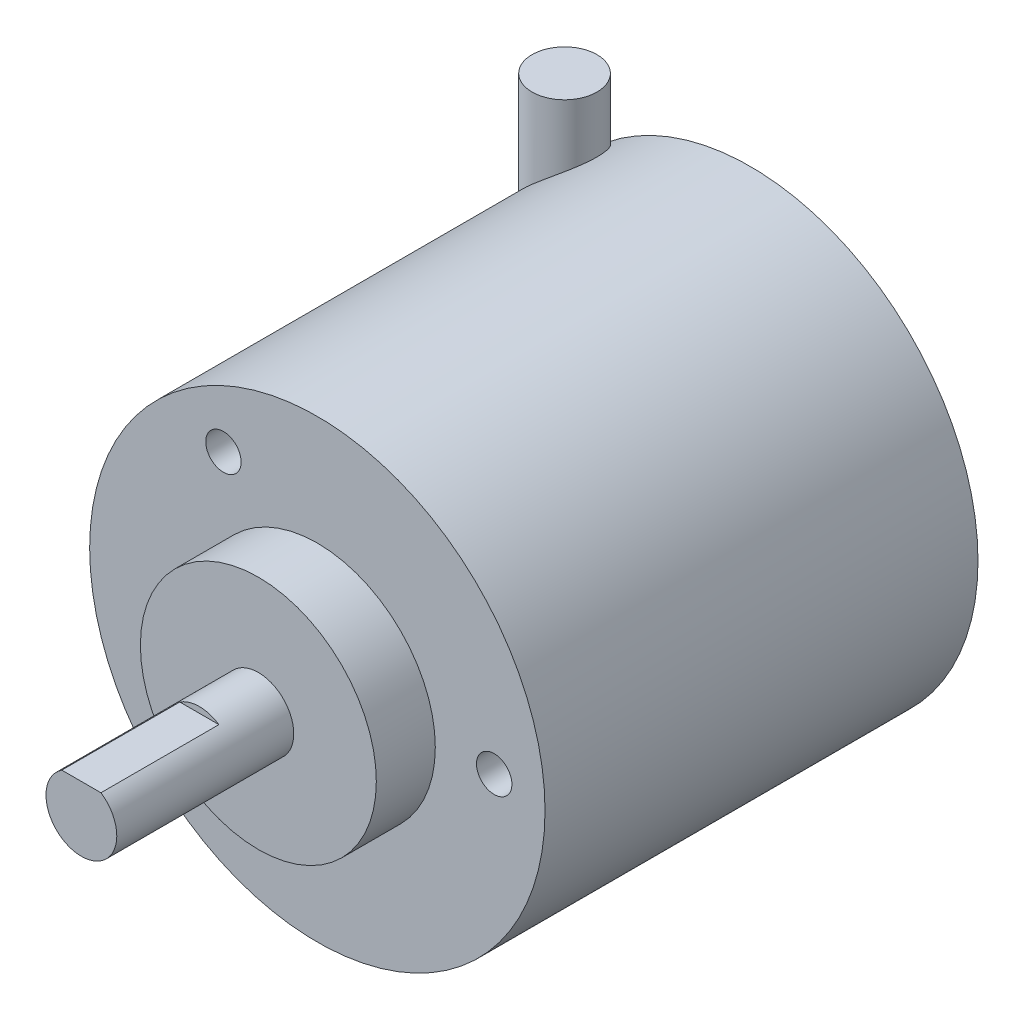
ISO-10303-21;
HEADER;
FILE_DESCRIPTION(('STEP AP214'),'2;1');
FILE_NAME('part.step','',(''),(''),'','','');
FILE_SCHEMA(('AUTOMOTIVE_DESIGN { 1 0 10303 214 1 1 1 1 }'));
ENDSEC;
DATA;
#1=APPLICATION_CONTEXT('core data for automotive mechanical design processes');
#2=APPLICATION_PROTOCOL_DEFINITION('international standard','automotive_design',2000,#1);
#3=PRODUCT_CONTEXT('',#1,'mechanical');
#4=PRODUCT('Part','Part','',(#3));
#5=PRODUCT_RELATED_PRODUCT_CATEGORY('part','',(#4));
#6=PRODUCT_DEFINITION_FORMATION('','',#4);
#7=PRODUCT_DEFINITION_CONTEXT('part definition',#1,'design');
#8=PRODUCT_DEFINITION('design','',#6,#7);
#9=PRODUCT_DEFINITION_SHAPE('','',#8);
#10=(LENGTH_UNIT() NAMED_UNIT(*) SI_UNIT(.MILLI.,.METRE.));
#11=(NAMED_UNIT(*) PLANE_ANGLE_UNIT() SI_UNIT($,.RADIAN.));
#12=(NAMED_UNIT(*) SI_UNIT($,.STERADIAN.) SOLID_ANGLE_UNIT());
#13=UNCERTAINTY_MEASURE_WITH_UNIT(LENGTH_MEASURE(1.E-05),#10,'distance_accuracy_value','');
#14=(GEOMETRIC_REPRESENTATION_CONTEXT(3) GLOBAL_UNCERTAINTY_ASSIGNED_CONTEXT((#13)) GLOBAL_UNIT_ASSIGNED_CONTEXT((#10,
#11,#12)) REPRESENTATION_CONTEXT('',''));
#15=CARTESIAN_POINT('',(0.,0.,0.));
#16=DIRECTION('',(0.,0.,1.));
#17=DIRECTION('',(1.,0.,0.));
#18=AXIS2_PLACEMENT_3D('',#15,#16,#17);
#19=CARTESIAN_POINT('',(-14.127422453689,5.37928778044314,36.7));
#20=DIRECTION('',(0.,0.,-1.));
#21=DIRECTION('',(-1.,0.,0.));
#22=AXIS2_PLACEMENT_3D('',#19,#20,#21);
#23=CYLINDRICAL_SURFACE('',#22,19.3);
#24=CARTESIAN_POINT('',(-14.127422453689,5.37928778044314,0.));
#25=DIRECTION('',(0.,0.,1.));
#26=DIRECTION('',(1.,0.,0.));
#27=AXIS2_PLACEMENT_3D('',#24,#25,#26);
#28=CIRCLE('',#27,19.3);
#29=CARTESIAN_POINT('',(5.17257754631097,5.37928778044314,0.));
#30=VERTEX_POINT('',#29);
#31=EDGE_CURVE('E86',#30,#30,#28,.T.);
#32=ORIENTED_EDGE('',*,*,#31,.T.);
#33=EDGE_LOOP('',(#32));
#34=FACE_BOUND('',#33,.T.);
#35=CARTESIAN_POINT('',(-14.127422453689,5.37928778044314,36.7));
#36=DIRECTION('',(0.,0.,1.));
#37=DIRECTION('',(1.,0.,0.));
#38=AXIS2_PLACEMENT_3D('',#35,#36,#37);
#39=CIRCLE('',#38,19.3);
#40=CARTESIAN_POINT('',(5.17257754631097,5.37928778044314,36.7));
#41=VERTEX_POINT('',#40);
#42=EDGE_CURVE('E98',#41,#41,#39,.T.);
#43=ORIENTED_EDGE('',*,*,#42,.F.);
#44=EDGE_LOOP('',(#43));
#45=FACE_BOUND('',#44,.T.);
#46=CARTESIAN_POINT('',(-24.4618309999001,21.6792877804431,4.436969061221));
#47=CARTESIAN_POINT('',(-24.3954269592363,21.7213897244254,4.32408699400776));
#48=CARTESIAN_POINT('',(-24.3362571430019,21.75833571968,4.20499329788579));
#49=CARTESIAN_POINT('',(-24.2351000824218,21.8209547526767,3.956901826202));
#50=CARTESIAN_POINT('',(-24.1931114830915,21.8466286793942,3.82790483261005));
#51=CARTESIAN_POINT('',(-24.1283682670721,21.8860301317163,3.56305361029655));
#52=CARTESIAN_POINT('',(-24.1056595355882,21.899729159888,3.42718383365912));
#53=CARTESIAN_POINT('',(-24.0808818584337,21.9146700217089,3.15287191173048));
#54=CARTESIAN_POINT('',(-24.078813883202,21.9159112696472,3.01442964579855));
#55=CARTESIAN_POINT('',(-24.0951448159497,21.9060716591115,2.7438666771799));
#56=CARTESIAN_POINT('',(-24.1128655024961,21.8953991286704,2.6116888368001));
#57=CARTESIAN_POINT('',(-24.1667829100004,21.8626801345796,2.35271721531145));
#58=CARTESIAN_POINT('',(-24.2029636627617,21.8406435008502,2.22591888336503));
#59=CARTESIAN_POINT('',(-24.2765131352396,21.7953500858177,2.02346476766417));
#60=CARTESIAN_POINT('',(-24.3091169889493,21.7751676891331,1.94532479044448));
#61=CARTESIAN_POINT('',(-24.380796251009,21.7304380008308,1.7933817580697));
#62=CARTESIAN_POINT('',(-24.4198708461004,21.7058912577063,1.71957815948512));
#63=CARTESIAN_POINT('',(-24.5017956304821,21.6539495000809,1.58031176856348));
#64=CARTESIAN_POINT('',(-24.5443778857499,21.6267454603986,1.51461923099794));
#65=CARTESIAN_POINT('',(-24.634147121835,21.5688399977563,1.38808408128311));
#66=CARTESIAN_POINT('',(-24.6813362378488,21.5381369519567,1.3272437420029));
#67=CARTESIAN_POINT('',(-24.829006197955,21.4410411887427,1.15228932280852));
#68=CARTESIAN_POINT('',(-24.9355146609951,21.3697087882652,1.04586664245185));
#69=CARTESIAN_POINT('',(-25.1585341826467,21.2166717923574,0.855601060183813));
#70=CARTESIAN_POINT('',(-25.2749666138909,21.1350466486761,0.771599119810876));
#71=CARTESIAN_POINT('',(-25.5143288505001,20.9629376193649,0.624832335274661));
#72=CARTESIAN_POINT('',(-25.637258779755,20.8724535647912,0.562067896222604));
#73=CARTESIAN_POINT('',(-25.9372581772652,20.6457845868236,0.435307938999463));
#74=CARTESIAN_POINT('',(-26.1158940553332,20.5060520928569,0.381322042421938));
#75=CARTESIAN_POINT('',(-26.4723552515206,20.216592466512,0.310172339548924));
#76=CARTESIAN_POINT('',(-26.6501791488985,20.0668520891793,0.293058367815248));
#77=CARTESIAN_POINT('',(-27.0024077046476,19.759140165136,0.292171428531755));
#78=CARTESIAN_POINT('',(-27.176741517084,19.6010889433028,0.30881927231283));
#79=CARTESIAN_POINT('',(-27.5165784247489,19.2816228329611,0.373530333732863));
#80=CARTESIAN_POINT('',(-27.6820722045133,19.1202046360265,0.421626010624828));
#81=CARTESIAN_POINT('',(-27.9372997892144,18.8624562902513,0.522366443721541));
#82=CARTESIAN_POINT('',(-28.0307936505854,18.765991225622,0.565447034921579));
#83=CARTESIAN_POINT('',(-28.213171343637,18.5739529370671,0.662302692396918));
#84=CARTESIAN_POINT('',(-28.3020535153047,18.4783800442988,0.716081576391463));
#85=CARTESIAN_POINT('',(-28.4744359836097,18.2893437114289,0.83439524636669));
#86=CARTESIAN_POINT('',(-28.5579439755962,18.1958773855058,0.898914155984753));
#87=CARTESIAN_POINT('',(-28.7189184915506,18.0123051818836,1.03914468700005));
#88=CARTESIAN_POINT('',(-28.7963895344267,17.9221968174934,1.11484781119476));
#89=CARTESIAN_POINT('',(-28.9516306845141,17.7384415732718,1.2862384952094));
#90=CARTESIAN_POINT('',(-29.0286780854026,17.6453208982038,1.38316020765676));
#91=CARTESIAN_POINT('',(-29.1721816048122,17.4688741120636,1.59254915584838));
#92=CARTESIAN_POINT('',(-29.2386530966638,17.3855338311788,1.70499337508039));
#93=CARTESIAN_POINT('',(-29.3442584990989,17.2512499421746,1.91901233121762));
#94=CARTESIAN_POINT('',(-29.3861731134311,17.1972461895917,2.01726430401542));
#95=CARTESIAN_POINT('',(-29.4595355328807,17.1019125348615,2.22341060883801));
#96=CARTESIAN_POINT('',(-29.4909999708666,17.0605625009391,2.33128926804305));
#97=CARTESIAN_POINT('',(-29.5361961193064,17.0008553208531,2.53362800353154));
#98=CARTESIAN_POINT('',(-29.5521646951306,16.9796178349479,2.62672632240197));
#99=CARTESIAN_POINT('',(-29.5744231256732,16.9499630874699,2.81606652928645));
#100=CARTESIAN_POINT('',(-29.5807214375192,16.9415346238348,2.91230559523717));
#101=CARTESIAN_POINT('',(-29.5830990357869,16.9383564159302,3.10532573675747));
#102=CARTESIAN_POINT('',(-29.5791590685955,16.9436324436577,3.20210749150187));
#103=CARTESIAN_POINT('',(-29.5613797402562,16.9673493033261,3.39311520169996));
#104=CARTESIAN_POINT('',(-29.5475329905458,16.9857999609974,3.48733919508185));
#105=CARTESIAN_POINT('',(-29.5070146289113,17.0394545622158,3.69101896438855));
#106=CARTESIAN_POINT('',(-29.4782023983724,17.0774375315785,3.79930648202103));
#107=CARTESIAN_POINT('',(-29.4099082754263,17.1665170655486,4.00670513869211));
#108=CARTESIAN_POINT('',(-29.3704068513362,17.2176376269551,4.10579902924819));
#109=CARTESIAN_POINT('',(-29.2625611952582,17.3554433335177,4.3382441503263));
#110=CARTESIAN_POINT('',(-29.1893526235728,17.447602805818,4.46605186180768));
#111=CARTESIAN_POINT('',(-29.0295463572815,17.6443955281485,4.70219103934962));
#112=CARTESIAN_POINT('',(-28.9429178177715,17.7490573839311,4.81047636161507));
#113=CARTESIAN_POINT('',(-28.7824720289005,17.9383816521058,4.98394861256274));
#114=CARTESIAN_POINT('',(-28.710949355779,18.0214143680719,5.05311165095595));
#115=CARTESIAN_POINT('',(-28.5628073557596,18.1903094794063,5.18196871340954));
#116=CARTESIAN_POINT('',(-28.4861856615727,18.2761731796311,5.24165829514423));
#117=CARTESIAN_POINT('',(-28.3284113142283,18.4497003117028,5.35191009916227));
#118=CARTESIAN_POINT('',(-28.2472552142733,18.5373650797147,5.40246525091069));
#119=CARTESIAN_POINT('',(-28.0809455137809,18.7135998215936,5.49453928445266));
#120=CARTESIAN_POINT('',(-27.9957925130403,18.8021696580902,5.53605951683868));
#121=CARTESIAN_POINT('',(-27.8194972589797,18.9819843322212,5.61107235939452));
#122=CARTESIAN_POINT('',(-27.7282548864319,19.0732360633627,5.6443142822721));
#123=CARTESIAN_POINT('',(-27.5424076170676,19.2553521862898,5.70107406266533));
#124=CARTESIAN_POINT('',(-27.4478014730154,19.3462164201125,5.72458827158586));
#125=CARTESIAN_POINT('',(-27.1598108166234,19.6171207308823,5.77999782939087));
#126=CARTESIAN_POINT('',(-26.9619221983381,19.7958121551041,5.79690216981606));
#127=CARTESIAN_POINT('',(-26.5891229846372,20.1186153785828,5.78722983734891));
#128=CARTESIAN_POINT('',(-26.4151015584431,20.2639537457988,5.76666946633819));
#129=CARTESIAN_POINT('',(-26.0667728692219,20.5447639306449,5.68995624503519));
#130=CARTESIAN_POINT('',(-25.8924660771055,20.6802456356183,5.63383962615987));
#131=CARTESIAN_POINT('',(-25.5839858899957,20.9120557616385,5.49765786189497));
#132=CARTESIAN_POINT('',(-25.4486455798764,21.0108520454894,5.42444738921801));
#133=CARTESIAN_POINT('',(-25.1870750174222,21.196990656117,5.25185929167325));
#134=CARTESIAN_POINT('',(-25.0608319844283,21.2843491984882,5.15251932636224));
#135=CARTESIAN_POINT('',(-24.8512732909981,21.426130040132,4.95426220032295));
#136=CARTESIAN_POINT('',(-24.7648357851831,21.4834707920754,4.86071566945282));
#137=CARTESIAN_POINT('',(-24.6037393661332,21.5887303035475,4.6592220162268));
#138=CARTESIAN_POINT('',(-24.5290758869007,21.6366527173161,4.55128050640213));
#139=CARTESIAN_POINT('',(-24.4618309999001,21.6792877804431,4.436969061221));
#140=B_SPLINE_CURVE_WITH_KNOTS('',3,(#46,#47,#48,#49,#50,#51,#52,#53,#54,#55,#56,#57,#58,#59,
#60,#61,#62,#63,#64,#65,#66,#67,#68,#69,#70,#71,#72,#73,#74,#75,#76,#77,#78,#79,#80,#81,#82,#83,
#84,#85,#86,#87,#88,#89,#90,#91,#92,#93,#94,#95,#96,#97,#98,#99,#100,#101,#102,#103,#104,#105,
#106,#107,#108,#109,#110,#111,#112,#113,#114,#115,#116,#117,#118,#119,#120,#121,#122,#123,#124,
#125,#126,#127,#128,#129,#130,#131,#132,#133,#134,#135,#136,#137,#138,#139),.UNSPECIFIED.,.T.,
.F.,(4,2,2,2,2,2,2,2,2,2,2,2,2,2,2,2,2,2,2,2,2,2,2,2,2,2,2,2,2,2,2,2,2,2,2,2,2,2,2,2,2,2,2,2,2,
2,4),(0.,0.412267144589953,0.824501769751662,1.23771476601219,1.65094718966612,2.05043996367447,
2.44958775564532,2.71028966290897,2.97095882934903,3.21923120200581,3.46761919569546,
3.96484760665466,4.45844915073924,4.95206010987931,5.64769418418185,6.34426786033122,
7.04957706416554,7.75561541287369,8.17843168448109,8.60139911093789,9.02374675273807,
9.44577515068839,9.90938803065256,10.3723207130451,10.7302137932229,11.087534477398,
11.3767461693481,11.6657047869049,11.9552071991645,12.2449257501499,12.5979247639738,
12.9515731974624,13.4699524249577,13.9895412912845,14.3778279457914,14.7662961424526,
15.1550637578742,15.5437732180598,15.9431166657158,16.342609760497,17.1401241857555,
17.8206135625814,18.5004106410926,19.0468937393012,19.5925934850184,20.0102433605558,
20.4277308699735),.UNSPECIFIED.);
#141=CARTESIAN_POINT('',(-24.4618309999001,21.6792877804431,4.436969061221));
#142=VERTEX_POINT('',#141);
#143=EDGE_CURVE('E11',#142,#142,#140,.T.);
#144=ORIENTED_EDGE('',*,*,#143,.F.);
#145=EDGE_LOOP('',(#144));
#146=FACE_BOUND('',#145,.T.);
#147=ADVANCED_FACE('F37',(#34,#45,#146),#23,.T.);
#148=CARTESIAN_POINT('',(-14.127422453689,5.37928778044314,36.7));
#149=DIRECTION('',(0.,0.,1.));
#150=DIRECTION('',(1.,0.,0.));
#151=AXIS2_PLACEMENT_3D('',#148,#149,#150);
#152=PLANE('',#151);
#153=CARTESIAN_POINT('',(0.862954928663456,5.91648973004398,36.7));
#154=DIRECTION('',(0.,0.,1.));
#155=DIRECTION('',(1.,0.,0.));
#156=AXIS2_PLACEMENT_3D('',#153,#154,#155);
#157=CIRCLE('',#156,1.5);
#158=CARTESIAN_POINT('',(2.36295492866346,5.91648973004398,36.7));
#159=VERTEX_POINT('',#158);
#160=EDGE_CURVE('E286',#159,#159,#157,.T.);
#161=ORIENTED_EDGE('',*,*,#160,.F.);
#162=EDGE_LOOP('',(#161));
#163=FACE_BOUND('',#162,.T.);
#164=CARTESIAN_POINT('',(-21.1573806095481,-7.87136081979079,36.7));
#165=DIRECTION('',(0.,0.,1.));
#166=DIRECTION('',(1.,0.,0.));
#167=AXIS2_PLACEMENT_3D('',#164,#165,#166);
#168=CIRCLE('',#167,1.5);
#169=CARTESIAN_POINT('',(-19.6573806095481,-7.87136081979079,36.7));
#170=VERTEX_POINT('',#169);
#171=EDGE_CURVE('E292',#170,#170,#168,.T.);
#172=ORIENTED_EDGE('',*,*,#171,.F.);
#173=EDGE_LOOP('',(#172));
#174=FACE_BOUND('',#173,.T.);
#175=CARTESIAN_POINT('',(-22.0878416801824,18.0927344310751,36.7));
#176=DIRECTION('',(0.,0.,1.));
#177=DIRECTION('',(1.,0.,0.));
#178=AXIS2_PLACEMENT_3D('',#175,#176,#177);
#179=CIRCLE('',#178,1.5);
#180=CARTESIAN_POINT('',(-20.5878416801824,18.0927344310751,36.7));
#181=VERTEX_POINT('',#180);
#182=EDGE_CURVE('E79',#181,#181,#179,.T.);
#183=ORIENTED_EDGE('',*,*,#182,.F.);
#184=EDGE_LOOP('',(#183));
#185=FACE_BOUND('',#184,.T.);
#186=CARTESIAN_POINT('',(-14.127422453689,5.37928778044314,36.7));
#187=DIRECTION('',(0.,0.,1.));
#188=DIRECTION('',(1.,0.,0.));
#189=AXIS2_PLACEMENT_3D('',#186,#187,#188);
#190=CIRCLE('',#189,10.);
#191=CARTESIAN_POINT('',(-4.12742245368903,5.37928778044314,36.7));
#192=VERTEX_POINT('',#191);
#193=EDGE_CURVE('E94',#192,#192,#190,.T.);
#194=ORIENTED_EDGE('',*,*,#193,.F.);
#195=EDGE_LOOP('',(#194));
#196=FACE_BOUND('',#195,.T.);
#197=ORIENTED_EDGE('',*,*,#42,.T.);
#198=EDGE_LOOP('',(#197));
#199=FACE_BOUND('',#198,.T.);
#200=ADVANCED_FACE('F108',(#163,#174,#185,#196,#199),#152,.T.);
#201=CARTESIAN_POINT('',(-14.127422453689,5.37928778044314,0.));
#202=DIRECTION('',(0.,0.,1.));
#203=DIRECTION('',(1.,0.,0.));
#204=AXIS2_PLACEMENT_3D('',#201,#202,#203);
#205=PLANE('',#204);
#206=ORIENTED_EDGE('',*,*,#31,.F.);
#207=EDGE_LOOP('',(#206));
#208=FACE_BOUND('',#207,.T.);
#209=ADVANCED_FACE('F105',(#208),#205,.F.);
#210=CARTESIAN_POINT('',(-14.127422453689,5.37928778044314,41.7));
#211=DIRECTION('',(0.,0.,-1.));
#212=DIRECTION('',(-1.,0.,0.));
#213=AXIS2_PLACEMENT_3D('',#210,#211,#212);
#214=CYLINDRICAL_SURFACE('',#213,10.);
#215=CARTESIAN_POINT('',(-14.127422453689,5.37928778044314,41.7));
#216=DIRECTION('',(0.,0.,1.));
#217=DIRECTION('',(1.,0.,0.));
#218=AXIS2_PLACEMENT_3D('',#215,#216,#217);
#219=CIRCLE('',#218,10.);
#220=CARTESIAN_POINT('',(-4.12742245368903,5.37928778044314,41.7));
#221=VERTEX_POINT('',#220);
#222=EDGE_CURVE('E82',#221,#221,#219,.T.);
#223=ORIENTED_EDGE('',*,*,#222,.F.);
#224=EDGE_LOOP('',(#223));
#225=FACE_BOUND('',#224,.T.);
#226=ORIENTED_EDGE('',*,*,#193,.T.);
#227=EDGE_LOOP('',(#226));
#228=FACE_BOUND('',#227,.T.);
#229=ADVANCED_FACE('F107',(#225,#228),#214,.T.);
#230=CARTESIAN_POINT('',(-14.127422453689,5.37928778044314,41.7));
#231=DIRECTION('',(0.,0.,1.));
#232=DIRECTION('',(1.,0.,0.));
#233=AXIS2_PLACEMENT_3D('',#230,#231,#232);
#234=PLANE('',#233);
#235=CARTESIAN_POINT('',(-14.127422453689,5.37928778044314,41.7));
#236=DIRECTION('',(0.,0.,1.));
#237=DIRECTION('',(1.,0.,0.));
#238=AXIS2_PLACEMENT_3D('',#235,#236,#237);
#239=CIRCLE('',#238,3.);
#240=CARTESIAN_POINT('',(-11.127422453689,5.37928778044314,41.7));
#241=VERTEX_POINT('',#240);
#242=EDGE_CURVE('E49',#241,#241,#239,.T.);
#243=ORIENTED_EDGE('',*,*,#242,.F.);
#244=EDGE_LOOP('',(#243));
#245=FACE_BOUND('',#244,.T.);
#246=ORIENTED_EDGE('',*,*,#222,.T.);
#247=EDGE_LOOP('',(#246));
#248=FACE_BOUND('',#247,.T.);
#249=ADVANCED_FACE('F113',(#245,#248),#234,.T.);
#250=CARTESIAN_POINT('',(-14.127422453689,5.37928778044314,56.7));
#251=DIRECTION('',(0.,0.,-1.));
#252=DIRECTION('',(-1.,0.,0.));
#253=AXIS2_PLACEMENT_3D('',#250,#251,#252);
#254=CYLINDRICAL_SURFACE('',#253,3.);
#255=CARTESIAN_POINT('',(-14.127422453689,5.37928778044314,56.7));
#256=DIRECTION('',(0.,0.,1.));
#257=DIRECTION('',(1.,0.,0.));
#258=AXIS2_PLACEMENT_3D('',#255,#256,#257);
#259=CIRCLE('',#258,3.);
#260=CARTESIAN_POINT('',(-15.7857348488667,7.87928778044314,56.7));
#261=VERTEX_POINT('',#260);
#262=CARTESIAN_POINT('',(-12.4691100585113,7.87928778044314,56.7));
#263=VERTEX_POINT('',#262);
#264=EDGE_CURVE('E78',#261,#263,#259,.T.);
#265=ORIENTED_EDGE('',*,*,#264,.F.);
#266=DIRECTION('',(0.,0.,1.));
#267=VECTOR('',#266,1.);
#268=CARTESIAN_POINT('',(-15.7857348488667,7.87928778044314,46.7));
#269=LINE('',#268,#267);
#270=CARTESIAN_POINT('',(-15.7857348488667,7.87928778044314,46.7));
#271=VERTEX_POINT('',#270);
#272=EDGE_CURVE('E56',#271,#261,#269,.T.);
#273=ORIENTED_EDGE('',*,*,#272,.F.);
#274=CARTESIAN_POINT('',(-14.127422453689,5.37928778044314,46.7));
#275=DIRECTION('',(0.,0.,1.));
#276=DIRECTION('',(1.,0.,0.));
#277=AXIS2_PLACEMENT_3D('',#274,#275,#276);
#278=CIRCLE('',#277,3.);
#279=CARTESIAN_POINT('',(-12.4691100585113,7.87928778044314,46.7));
#280=VERTEX_POINT('',#279);
#281=EDGE_CURVE('E72',#280,#271,#278,.T.);
#282=ORIENTED_EDGE('',*,*,#281,.F.);
#283=DIRECTION('',(0.,0.,1.));
#284=VECTOR('',#283,1.);
#285=CARTESIAN_POINT('',(-12.4691100585113,7.87928778044314,46.7));
#286=LINE('',#285,#284);
#287=EDGE_CURVE('E62',#280,#263,#286,.T.);
#288=ORIENTED_EDGE('',*,*,#287,.T.);
#289=EDGE_LOOP('',(#265,#273,#282,#288));
#290=FACE_BOUND('',#289,.T.);
#291=ORIENTED_EDGE('',*,*,#242,.T.);
#292=EDGE_LOOP('',(#291));
#293=FACE_BOUND('',#292,.T.);
#294=ADVANCED_FACE('F76',(#290,#293),#254,.T.);
#295=CARTESIAN_POINT('',(-14.127422453689,5.37928778044314,56.7));
#296=DIRECTION('',(0.,0.,1.));
#297=DIRECTION('',(1.,0.,0.));
#298=AXIS2_PLACEMENT_3D('',#295,#296,#297);
#299=PLANE('',#298);
#300=DIRECTION('',(1.,0.,0.));
#301=VECTOR('',#300,1.);
#302=CARTESIAN_POINT('',(0.,7.87928778044314,56.7));
#303=LINE('',#302,#301);
#304=EDGE_CURVE('E67',#261,#263,#303,.T.);
#305=ORIENTED_EDGE('',*,*,#304,.F.);
#306=ORIENTED_EDGE('',*,*,#264,.T.);
#307=EDGE_LOOP('',(#305,#306));
#308=FACE_BOUND('',#307,.T.);
#309=ADVANCED_FACE('F81',(#308),#299,.T.);
#310=CARTESIAN_POINT('',(-26.8321178772339,26.6792877804431,3.04260895022423));
#311=DIRECTION('',(0.,-1.,0.));
#312=DIRECTION('',(0.,0.,-1.));
#313=AXIS2_PLACEMENT_3D('',#310,#311,#312);
#314=CYLINDRICAL_SURFACE('',#313,2.75);
#315=CARTESIAN_POINT('',(-26.8321178772339,26.6792877804431,3.04260895022423));
#316=DIRECTION('',(0.,1.,0.));
#317=DIRECTION('',(0.,0.,1.));
#318=AXIS2_PLACEMENT_3D('',#315,#316,#317);
#319=CIRCLE('',#318,2.75);
#320=CARTESIAN_POINT('',(-26.8321178772339,26.6792877804431,5.79260895022423));
#321=VERTEX_POINT('',#320);
#322=EDGE_CURVE('E83',#321,#321,#319,.T.);
#323=ORIENTED_EDGE('',*,*,#322,.F.);
#324=EDGE_LOOP('',(#323));
#325=FACE_BOUND('',#324,.T.);
#326=ORIENTED_EDGE('',*,*,#143,.T.);
#327=EDGE_LOOP('',(#326));
#328=FACE_BOUND('',#327,.T.);
#329=ADVANCED_FACE('F214',(#325,#328),#314,.T.);
#330=CARTESIAN_POINT('',(-26.8321178772339,26.6792877804431,3.04260895022423));
#331=DIRECTION('',(0.,1.,0.));
#332=DIRECTION('',(0.,0.,1.));
#333=AXIS2_PLACEMENT_3D('',#330,#331,#332);
#334=PLANE('',#333);
#335=ORIENTED_EDGE('',*,*,#322,.T.);
#336=EDGE_LOOP('',(#335));
#337=FACE_BOUND('',#336,.T.);
#338=ADVANCED_FACE('F134',(#337),#334,.T.);
#339=CARTESIAN_POINT('',(-22.0878416801824,18.0927344310751,26.7));
#340=DIRECTION('',(0.,0.,1.));
#341=DIRECTION('',(1.,0.,0.));
#342=AXIS2_PLACEMENT_3D('',#339,#340,#341);
#343=CYLINDRICAL_SURFACE('',#342,1.5);
#344=CARTESIAN_POINT('',(-22.0878416801824,18.0927344310751,26.7));
#345=DIRECTION('',(0.,0.,1.));
#346=DIRECTION('',(1.,0.,0.));
#347=AXIS2_PLACEMENT_3D('',#344,#345,#346);
#348=CIRCLE('',#347,1.5);
#349=CARTESIAN_POINT('',(-20.5878416801824,18.0927344310751,26.7));
#350=VERTEX_POINT('',#349);
#351=EDGE_CURVE('E295',#350,#350,#348,.T.);
#352=ORIENTED_EDGE('',*,*,#351,.F.);
#353=EDGE_LOOP('',(#352));
#354=FACE_BOUND('',#353,.T.);
#355=ORIENTED_EDGE('',*,*,#182,.T.);
#356=EDGE_LOOP('',(#355));
#357=FACE_BOUND('',#356,.T.);
#358=ADVANCED_FACE('F138',(#354,#357),#343,.F.);
#359=CARTESIAN_POINT('',(-22.0878416801824,18.0927344310751,26.7));
#360=DIRECTION('',(0.,0.,1.));
#361=DIRECTION('',(1.,0.,0.));
#362=AXIS2_PLACEMENT_3D('',#359,#360,#361);
#363=PLANE('',#362);
#364=ORIENTED_EDGE('',*,*,#351,.T.);
#365=EDGE_LOOP('',(#364));
#366=FACE_BOUND('',#365,.T.);
#367=ADVANCED_FACE('F143',(#366),#363,.T.);
#368=CARTESIAN_POINT('',(-21.1573806095481,-7.87136081979079,26.7));
#369=DIRECTION('',(0.,0.,1.));
#370=DIRECTION('',(1.,0.,0.));
#371=AXIS2_PLACEMENT_3D('',#368,#369,#370);
#372=CYLINDRICAL_SURFACE('',#371,1.5);
#373=CARTESIAN_POINT('',(-21.1573806095481,-7.87136081979079,26.7));
#374=DIRECTION('',(0.,0.,1.));
#375=DIRECTION('',(1.,0.,0.));
#376=AXIS2_PLACEMENT_3D('',#373,#374,#375);
#377=CIRCLE('',#376,1.5);
#378=CARTESIAN_POINT('',(-19.6573806095481,-7.87136081979079,26.7));
#379=VERTEX_POINT('',#378);
#380=EDGE_CURVE('E289',#379,#379,#377,.T.);
#381=ORIENTED_EDGE('',*,*,#380,.F.);
#382=EDGE_LOOP('',(#381));
#383=FACE_BOUND('',#382,.T.);
#384=ORIENTED_EDGE('',*,*,#171,.T.);
#385=EDGE_LOOP('',(#384));
#386=FACE_BOUND('',#385,.T.);
#387=ADVANCED_FACE('F153',(#383,#386),#372,.F.);
#388=CARTESIAN_POINT('',(-21.1573806095481,-7.87136081979079,26.7));
#389=DIRECTION('',(0.,0.,1.));
#390=DIRECTION('',(1.,0.,0.));
#391=AXIS2_PLACEMENT_3D('',#388,#389,#390);
#392=PLANE('',#391);
#393=ORIENTED_EDGE('',*,*,#380,.T.);
#394=EDGE_LOOP('',(#393));
#395=FACE_BOUND('',#394,.T.);
#396=ADVANCED_FACE('F163',(#395),#392,.T.);
#397=CARTESIAN_POINT('',(0.862954928663456,5.91648973004398,26.7));
#398=DIRECTION('',(0.,0.,1.));
#399=DIRECTION('',(1.,0.,0.));
#400=AXIS2_PLACEMENT_3D('',#397,#398,#399);
#401=CYLINDRICAL_SURFACE('',#400,1.5);
#402=CARTESIAN_POINT('',(0.862954928663456,5.91648973004398,26.7));
#403=DIRECTION('',(0.,0.,1.));
#404=DIRECTION('',(1.,0.,0.));
#405=AXIS2_PLACEMENT_3D('',#402,#403,#404);
#406=CIRCLE('',#405,1.5);
#407=CARTESIAN_POINT('',(2.36295492866346,5.91648973004398,26.7));
#408=VERTEX_POINT('',#407);
#409=EDGE_CURVE('E89',#408,#408,#406,.T.);
#410=ORIENTED_EDGE('',*,*,#409,.F.);
#411=EDGE_LOOP('',(#410));
#412=FACE_BOUND('',#411,.T.);
#413=ORIENTED_EDGE('',*,*,#160,.T.);
#414=EDGE_LOOP('',(#413));
#415=FACE_BOUND('',#414,.T.);
#416=ADVANCED_FACE('F173',(#412,#415),#401,.F.);
#417=CARTESIAN_POINT('',(0.862954928663456,5.91648973004398,26.7));
#418=DIRECTION('',(0.,0.,1.));
#419=DIRECTION('',(1.,0.,0.));
#420=AXIS2_PLACEMENT_3D('',#417,#418,#419);
#421=PLANE('',#420);
#422=ORIENTED_EDGE('',*,*,#409,.T.);
#423=EDGE_LOOP('',(#422));
#424=FACE_BOUND('',#423,.T.);
#425=ADVANCED_FACE('F183',(#424),#421,.T.);
#426=CARTESIAN_POINT('',(0.,7.87928778044314,46.7));
#427=DIRECTION('',(0.,-1.,0.));
#428=DIRECTION('',(0.,0.,-1.));
#429=AXIS2_PLACEMENT_3D('',#426,#427,#428);
#430=PLANE('',#429);
#431=ORIENTED_EDGE('',*,*,#304,.T.);
#432=ORIENTED_EDGE('',*,*,#287,.F.);
#433=DIRECTION('',(1.,0.,0.));
#434=VECTOR('',#433,1.);
#435=CARTESIAN_POINT('',(0.,7.87928778044314,46.7));
#436=LINE('',#435,#434);
#437=EDGE_CURVE('E279',#271,#280,#436,.T.);
#438=ORIENTED_EDGE('',*,*,#437,.F.);
#439=ORIENTED_EDGE('',*,*,#272,.T.);
#440=EDGE_LOOP('',(#431,#432,#438,#439));
#441=FACE_BOUND('',#440,.T.);
#442=ADVANCED_FACE('F68',(#441),#430,.F.);
#443=CARTESIAN_POINT('',(0.,0.,46.7));
#444=DIRECTION('',(0.,0.,1.));
#445=DIRECTION('',(1.,0.,0.));
#446=AXIS2_PLACEMENT_3D('',#443,#444,#445);
#447=PLANE('',#446);
#448=ORIENTED_EDGE('',*,*,#281,.T.);
#449=ORIENTED_EDGE('',*,*,#437,.T.);
#450=EDGE_LOOP('',(#448,#449));
#451=FACE_BOUND('',#450,.T.);
#452=ADVANCED_FACE('F222',(#451),#447,.T.);
#453=CLOSED_SHELL('',(#147,#200,#209,#229,#249,#294,#309,#329,#338,#358,#367,#387,#396,#416,
#425,#442,#452));
#454=MANIFOLD_SOLID_BREP('B2',#453);
#455=ADVANCED_BREP_SHAPE_REPRESENTATION('',(#18,#454),#14);
#456=SHAPE_DEFINITION_REPRESENTATION(#9,#455);
ENDSEC;
END-ISO-10303-21;
